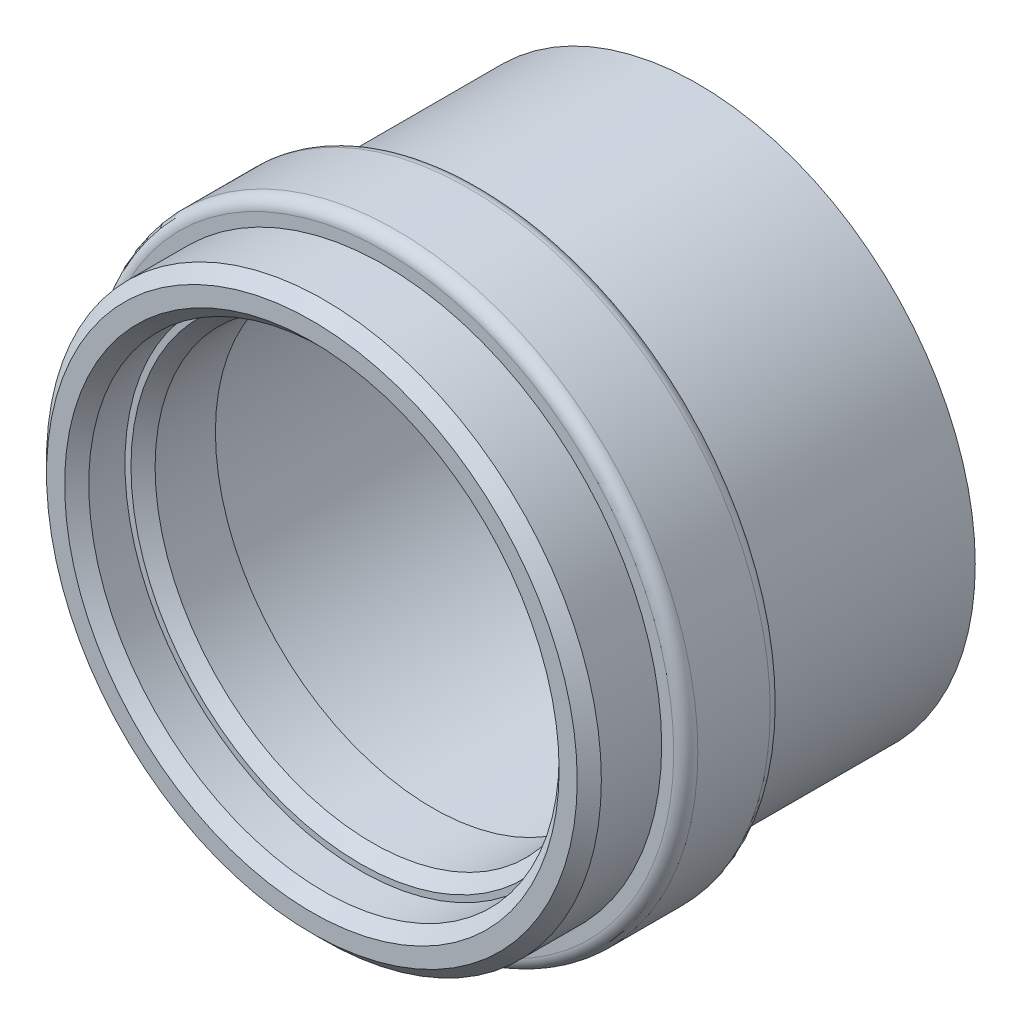
ISO-10303-21;
HEADER;
FILE_DESCRIPTION(('STEP AP214'),'2;1');
FILE_NAME('part.step','',(''),(''),'','','');
FILE_SCHEMA(('AUTOMOTIVE_DESIGN { 1 0 10303 214 1 1 1 1 }'));
ENDSEC;
DATA;
#1=APPLICATION_CONTEXT('core data for automotive mechanical design processes');
#2=APPLICATION_PROTOCOL_DEFINITION('international standard','automotive_design',2000,#1);
#3=PRODUCT_CONTEXT('',#1,'mechanical');
#4=PRODUCT('Part','Part','',(#3));
#5=PRODUCT_RELATED_PRODUCT_CATEGORY('part','',(#4));
#6=PRODUCT_DEFINITION_FORMATION('','',#4);
#7=PRODUCT_DEFINITION_CONTEXT('part definition',#1,'design');
#8=PRODUCT_DEFINITION('design','',#6,#7);
#9=PRODUCT_DEFINITION_SHAPE('','',#8);
#10=(LENGTH_UNIT() NAMED_UNIT(*) SI_UNIT(.MILLI.,.METRE.));
#11=(NAMED_UNIT(*) PLANE_ANGLE_UNIT() SI_UNIT($,.RADIAN.));
#12=(NAMED_UNIT(*) SI_UNIT($,.STERADIAN.) SOLID_ANGLE_UNIT());
#13=UNCERTAINTY_MEASURE_WITH_UNIT(LENGTH_MEASURE(1.E-05),#10,'distance_accuracy_value','');
#14=(GEOMETRIC_REPRESENTATION_CONTEXT(3) GLOBAL_UNCERTAINTY_ASSIGNED_CONTEXT((#13)) GLOBAL_UNIT_ASSIGNED_CONTEXT((#10,
#11,#12)) REPRESENTATION_CONTEXT('',''));
#15=CARTESIAN_POINT('',(0.,0.,0.));
#16=DIRECTION('',(0.,0.,1.));
#17=DIRECTION('',(1.,0.,0.));
#18=AXIS2_PLACEMENT_3D('',#15,#16,#17);
#19=CARTESIAN_POINT('',(0.,0.,0.));
#20=DIRECTION('',(0.,0.,1.));
#21=DIRECTION('',(1.,0.,0.));
#22=AXIS2_PLACEMENT_3D('',#19,#20,#21);
#23=CYLINDRICAL_SURFACE('',#22,9.);
#24=CARTESIAN_POINT('',(0.,0.,13.5));
#25=DIRECTION('',(0.,0.,1.));
#26=DIRECTION('',(1.,0.,0.));
#27=AXIS2_PLACEMENT_3D('',#24,#25,#26);
#28=CIRCLE('',#27,9.);
#29=CARTESIAN_POINT('',(9.,0.,13.5));
#30=VERTEX_POINT('',#29);
#31=EDGE_CURVE('E77',#30,#30,#28,.T.);
#32=ORIENTED_EDGE('',*,*,#31,.T.);
#33=EDGE_LOOP('',(#32));
#34=FACE_BOUND('',#33,.T.);
#35=CARTESIAN_POINT('',(0.,0.,11.));
#36=DIRECTION('',(0.,0.,-1.));
#37=DIRECTION('',(-1.,0.,0.));
#38=AXIS2_PLACEMENT_3D('',#35,#36,#37);
#39=CIRCLE('',#38,9.);
#40=CARTESIAN_POINT('',(-9.,0.,11.));
#41=VERTEX_POINT('',#40);
#42=EDGE_CURVE('E102',#41,#41,#39,.F.);
#43=ORIENTED_EDGE('',*,*,#42,.F.);
#44=EDGE_LOOP('',(#43));
#45=FACE_BOUND('',#44,.T.);
#46=ADVANCED_FACE('F45',(#34,#45),#23,.F.);
#47=CARTESIAN_POINT('',(0.,0.,16.));
#48=DIRECTION('',(0.,0.,-1.));
#49=DIRECTION('',(-1.,0.,0.));
#50=AXIS2_PLACEMENT_3D('',#47,#48,#49);
#51=CYLINDRICAL_SURFACE('',#50,11.5);
#52=CARTESIAN_POINT('',(0.,0.,0.));
#53=DIRECTION('',(0.,0.,1.));
#54=DIRECTION('',(1.,0.,0.));
#55=AXIS2_PLACEMENT_3D('',#52,#53,#54);
#56=CIRCLE('',#55,11.5);
#57=CARTESIAN_POINT('',(11.5,0.,0.));
#58=VERTEX_POINT('',#57);
#59=EDGE_CURVE('E111',#58,#58,#56,.T.);
#60=ORIENTED_EDGE('',*,*,#59,.T.);
#61=EDGE_LOOP('',(#60));
#62=FACE_BOUND('',#61,.T.);
#63=CARTESIAN_POINT('',(0.,0.,9.));
#64=DIRECTION('',(0.,0.,1.));
#65=DIRECTION('',(1.,0.,0.));
#66=AXIS2_PLACEMENT_3D('',#63,#64,#65);
#67=CIRCLE('',#66,11.5);
#68=CARTESIAN_POINT('',(11.5,0.,9.));
#69=VERTEX_POINT('',#68);
#70=EDGE_CURVE('E101',#69,#69,#67,.T.);
#71=ORIENTED_EDGE('',*,*,#70,.F.);
#72=EDGE_LOOP('',(#71));
#73=FACE_BOUND('',#72,.T.);
#74=ADVANCED_FACE('F146',(#62,#73),#51,.T.);
#75=CARTESIAN_POINT('',(0.,0.,0.));
#76=DIRECTION('',(0.,0.,1.));
#77=DIRECTION('',(1.,0.,0.));
#78=AXIS2_PLACEMENT_3D('',#75,#76,#77);
#79=PLANE('',#78);
#80=CARTESIAN_POINT('',(0.,0.,0.));
#81=DIRECTION('',(0.,0.,1.));
#82=DIRECTION('',(1.,0.,0.));
#83=AXIS2_PLACEMENT_3D('',#80,#81,#82);
#84=CIRCLE('',#83,10.5);
#85=CARTESIAN_POINT('',(10.5,0.,0.));
#86=VERTEX_POINT('',#85);
#87=EDGE_CURVE('E93',#86,#86,#84,.T.);
#88=ORIENTED_EDGE('',*,*,#87,.T.);
#89=EDGE_LOOP('',(#88));
#90=FACE_BOUND('',#89,.T.);
#91=ORIENTED_EDGE('',*,*,#59,.F.);
#92=EDGE_LOOP('',(#91));
#93=FACE_BOUND('',#92,.T.);
#94=ADVANCED_FACE('F152',(#90,#93),#79,.F.);
#95=CARTESIAN_POINT('',(0.,0.,9.));
#96=DIRECTION('',(0.,0.,1.));
#97=DIRECTION('',(1.,0.,0.));
#98=AXIS2_PLACEMENT_3D('',#95,#96,#97);
#99=CYLINDRICAL_SURFACE('',#98,12.5);
#100=CARTESIAN_POINT('',(0.,0.,9.5));
#101=DIRECTION('',(0.,0.,1.));
#102=DIRECTION('',(1.,0.,0.));
#103=AXIS2_PLACEMENT_3D('',#100,#101,#102);
#104=CIRCLE('',#103,12.5);
#105=CARTESIAN_POINT('',(12.5,0.,9.5));
#106=VERTEX_POINT('',#105);
#107=EDGE_CURVE('E58',#106,#106,#104,.T.);
#108=ORIENTED_EDGE('',*,*,#107,.T.);
#109=EDGE_LOOP('',(#108));
#110=FACE_BOUND('',#109,.T.);
#111=CARTESIAN_POINT('',(0.,0.,12.5));
#112=DIRECTION('',(0.,0.,1.));
#113=DIRECTION('',(1.,0.,0.));
#114=AXIS2_PLACEMENT_3D('',#111,#112,#113);
#115=CIRCLE('',#114,12.5);
#116=CARTESIAN_POINT('',(12.5,0.,12.5));
#117=VERTEX_POINT('',#116);
#118=EDGE_CURVE('E63',#117,#117,#115,.F.);
#119=ORIENTED_EDGE('',*,*,#118,.T.);
#120=EDGE_LOOP('',(#119));
#121=FACE_BOUND('',#120,.T.);
#122=ADVANCED_FACE('F168',(#110,#121),#99,.T.);
#123=CARTESIAN_POINT('',(0.,0.,9.));
#124=DIRECTION('',(0.,0.,1.));
#125=DIRECTION('',(1.,0.,0.));
#126=AXIS2_PLACEMENT_3D('',#123,#124,#125);
#127=PLANE('',#126);
#128=CARTESIAN_POINT('',(0.,0.,9.));
#129=DIRECTION('',(0.,0.,1.));
#130=DIRECTION('',(1.,0.,0.));
#131=AXIS2_PLACEMENT_3D('',#128,#129,#130);
#132=CIRCLE('',#131,12.);
#133=CARTESIAN_POINT('',(12.,0.,9.));
#134=VERTEX_POINT('',#133);
#135=EDGE_CURVE('E53',#134,#134,#132,.F.);
#136=ORIENTED_EDGE('',*,*,#135,.T.);
#137=EDGE_LOOP('',(#136));
#138=FACE_BOUND('',#137,.T.);
#139=ORIENTED_EDGE('',*,*,#70,.T.);
#140=EDGE_LOOP('',(#139));
#141=FACE_BOUND('',#140,.T.);
#142=ADVANCED_FACE('F164',(#138,#141),#127,.F.);
#143=CARTESIAN_POINT('',(0.,0.,13.));
#144=DIRECTION('',(0.,0.,1.));
#145=DIRECTION('',(1.,0.,0.));
#146=AXIS2_PLACEMENT_3D('',#143,#144,#145);
#147=PLANE('',#146);
#148=CARTESIAN_POINT('',(0.,0.,13.));
#149=DIRECTION('',(0.,0.,1.));
#150=DIRECTION('',(1.,0.,0.));
#151=AXIS2_PLACEMENT_3D('',#148,#149,#150);
#152=CIRCLE('',#151,12.);
#153=CARTESIAN_POINT('',(12.,0.,13.));
#154=VERTEX_POINT('',#153);
#155=EDGE_CURVE('E10',#154,#154,#152,.T.);
#156=ORIENTED_EDGE('',*,*,#155,.T.);
#157=EDGE_LOOP('',(#156));
#158=FACE_BOUND('',#157,.T.);
#159=CARTESIAN_POINT('',(0.,0.,13.));
#160=DIRECTION('',(0.,0.,1.));
#161=DIRECTION('',(1.,0.,0.));
#162=AXIS2_PLACEMENT_3D('',#159,#160,#161);
#163=CIRCLE('',#162,11.5);
#164=CARTESIAN_POINT('',(11.5,0.,13.));
#165=VERTEX_POINT('',#164);
#166=EDGE_CURVE('E112',#165,#165,#163,.T.);
#167=ORIENTED_EDGE('',*,*,#166,.F.);
#168=EDGE_LOOP('',(#167));
#169=FACE_BOUND('',#168,.T.);
#170=ADVANCED_FACE('F167',(#158,#169),#147,.T.);
#171=CARTESIAN_POINT('',(0.,0.,16.));
#172=DIRECTION('',(0.,0.,1.));
#173=DIRECTION('',(1.,0.,0.));
#174=AXIS2_PLACEMENT_3D('',#171,#172,#173);
#175=PLANE('',#174);
#176=CARTESIAN_POINT('',(0.,0.,16.));
#177=DIRECTION('',(0.,0.,1.));
#178=DIRECTION('',(1.,0.,0.));
#179=AXIS2_PLACEMENT_3D('',#176,#177,#178);
#180=CIRCLE('',#179,11.);
#181=CARTESIAN_POINT('',(11.,0.,16.));
#182=VERTEX_POINT('',#181);
#183=EDGE_CURVE('E85',#182,#182,#180,.T.);
#184=ORIENTED_EDGE('',*,*,#183,.T.);
#185=EDGE_LOOP('',(#184));
#186=FACE_BOUND('',#185,.T.);
#187=CARTESIAN_POINT('',(0.,0.,16.));
#188=DIRECTION('',(0.,0.,1.));
#189=DIRECTION('',(1.,0.,0.));
#190=AXIS2_PLACEMENT_3D('',#187,#188,#189);
#191=CIRCLE('',#190,10.25);
#192=CARTESIAN_POINT('',(10.25,0.,16.));
#193=VERTEX_POINT('',#192);
#194=EDGE_CURVE('E89',#193,#193,#191,.F.);
#195=ORIENTED_EDGE('',*,*,#194,.T.);
#196=EDGE_LOOP('',(#195));
#197=FACE_BOUND('',#196,.T.);
#198=ADVANCED_FACE('F171',(#186,#197),#175,.T.);
#199=CARTESIAN_POINT('',(0.,0.,15.5));
#200=DIRECTION('',(0.,0.,1.));
#201=DIRECTION('',(1.,0.,0.));
#202=AXIS2_PLACEMENT_3D('',#199,#200,#201);
#203=CIRCLE('',#202,11.5);
#204=CARTESIAN_POINT('',(11.5,0.,15.5));
#205=VERTEX_POINT('',#204);
#206=EDGE_CURVE('E81',#205,#205,#203,.F.);
#207=ORIENTED_EDGE('',*,*,#206,.T.);
#208=EDGE_LOOP('',(#207));
#209=FACE_BOUND('',#208,.T.);
#210=ORIENTED_EDGE('',*,*,#166,.T.);
#211=EDGE_LOOP('',(#210));
#212=FACE_BOUND('',#211,.T.);
#213=ADVANCED_FACE('F155',(#209,#212),#51,.T.);
#214=CARTESIAN_POINT('',(0.,0.,14.));
#215=DIRECTION('',(0.,0.,1.));
#216=DIRECTION('',(1.,0.,0.));
#217=AXIS2_PLACEMENT_3D('',#214,#215,#216);
#218=CYLINDRICAL_SURFACE('',#217,9.75);
#219=CARTESIAN_POINT('',(0.,0.,15.5));
#220=DIRECTION('',(0.,0.,1.));
#221=DIRECTION('',(1.,0.,0.));
#222=AXIS2_PLACEMENT_3D('',#219,#220,#221);
#223=CIRCLE('',#222,9.75);
#224=CARTESIAN_POINT('',(9.75,0.,15.5));
#225=VERTEX_POINT('',#224);
#226=EDGE_CURVE('E69',#225,#225,#223,.T.);
#227=ORIENTED_EDGE('',*,*,#226,.T.);
#228=EDGE_LOOP('',(#227));
#229=FACE_BOUND('',#228,.T.);
#230=CARTESIAN_POINT('',(0.,0.,14.));
#231=DIRECTION('',(0.,0.,1.));
#232=DIRECTION('',(1.,0.,0.));
#233=AXIS2_PLACEMENT_3D('',#230,#231,#232);
#234=CIRCLE('',#233,9.75);
#235=CARTESIAN_POINT('',(9.75,0.,14.));
#236=VERTEX_POINT('',#235);
#237=EDGE_CURVE('E106',#236,#236,#234,.T.);
#238=ORIENTED_EDGE('',*,*,#237,.F.);
#239=EDGE_LOOP('',(#238));
#240=FACE_BOUND('',#239,.T.);
#241=ADVANCED_FACE('F159',(#229,#240),#218,.F.);
#242=CARTESIAN_POINT('',(0.,0.,14.));
#243=DIRECTION('',(0.,0.,1.));
#244=DIRECTION('',(1.,0.,0.));
#245=AXIS2_PLACEMENT_3D('',#242,#243,#244);
#246=PLANE('',#245);
#247=CARTESIAN_POINT('',(0.,0.,14.));
#248=DIRECTION('',(0.,0.,1.));
#249=DIRECTION('',(1.,0.,0.));
#250=AXIS2_PLACEMENT_3D('',#247,#248,#249);
#251=CIRCLE('',#250,9.49999999999999);
#252=CARTESIAN_POINT('',(9.49999999999999,0.,14.));
#253=VERTEX_POINT('',#252);
#254=EDGE_CURVE('E73',#253,#253,#251,.F.);
#255=ORIENTED_EDGE('',*,*,#254,.T.);
#256=EDGE_LOOP('',(#255));
#257=FACE_BOUND('',#256,.T.);
#258=ORIENTED_EDGE('',*,*,#237,.T.);
#259=EDGE_LOOP('',(#258));
#260=FACE_BOUND('',#259,.T.);
#261=ADVANCED_FACE('F142',(#257,#260),#246,.T.);
#262=CARTESIAN_POINT('',(0.,0.,11.));
#263=DIRECTION('',(0.,0.,-1.));
#264=DIRECTION('',(-1.,0.,0.));
#265=AXIS2_PLACEMENT_3D('',#262,#263,#264);
#266=PLANE('',#265);
#267=CARTESIAN_POINT('',(0.,0.,11.));
#268=DIRECTION('',(0.,0.,-1.));
#269=DIRECTION('',(-1.,0.,0.));
#270=AXIS2_PLACEMENT_3D('',#267,#268,#269);
#271=CIRCLE('',#270,10.);
#272=CARTESIAN_POINT('',(-10.,0.,11.));
#273=VERTEX_POINT('',#272);
#274=EDGE_CURVE('E107',#273,#273,#271,.T.);
#275=ORIENTED_EDGE('',*,*,#274,.T.);
#276=EDGE_LOOP('',(#275));
#277=FACE_BOUND('',#276,.T.);
#278=ORIENTED_EDGE('',*,*,#42,.T.);
#279=EDGE_LOOP('',(#278));
#280=FACE_BOUND('',#279,.T.);
#281=ADVANCED_FACE('F126',(#277,#280),#266,.T.);
#282=CARTESIAN_POINT('',(0.,0.,11.));
#283=DIRECTION('',(0.,0.,-1.));
#284=DIRECTION('',(-1.,0.,0.));
#285=AXIS2_PLACEMENT_3D('',#282,#283,#284);
#286=CYLINDRICAL_SURFACE('',#285,10.);
#287=CARTESIAN_POINT('',(0.,0.,0.500000000000002));
#288=DIRECTION('',(0.,0.,1.));
#289=DIRECTION('',(1.,0.,0.));
#290=AXIS2_PLACEMENT_3D('',#287,#288,#289);
#291=CIRCLE('',#290,10.);
#292=CARTESIAN_POINT('',(10.,0.,0.500000000000002));
#293=VERTEX_POINT('',#292);
#294=EDGE_CURVE('E97',#293,#293,#291,.F.);
#295=ORIENTED_EDGE('',*,*,#294,.T.);
#296=EDGE_LOOP('',(#295));
#297=FACE_BOUND('',#296,.T.);
#298=ORIENTED_EDGE('',*,*,#274,.F.);
#299=EDGE_LOOP('',(#298));
#300=FACE_BOUND('',#299,.T.);
#301=ADVANCED_FACE('F129',(#297,#300),#286,.F.);
#302=CARTESIAN_POINT('',(0.,0.,0.500000000000002));
#303=DIRECTION('',(0.,0.,-1.));
#304=DIRECTION('',(-1.,0.,0.));
#305=AXIS2_PLACEMENT_3D('',#302,#303,#304);
#306=CONICAL_SURFACE('',#305,10.,0.785398163397452);
#307=ORIENTED_EDGE('',*,*,#87,.F.);
#308=EDGE_LOOP('',(#307));
#309=FACE_BOUND('',#308,.T.);
#310=ORIENTED_EDGE('',*,*,#294,.F.);
#311=EDGE_LOOP('',(#310));
#312=FACE_BOUND('',#311,.T.);
#313=ADVANCED_FACE('F131',(#309,#312),#306,.F.);
#314=CARTESIAN_POINT('',(0.,0.,16.));
#315=DIRECTION('',(0.,0.,-1.));
#316=DIRECTION('',(-1.,0.,0.));
#317=AXIS2_PLACEMENT_3D('',#314,#315,#316);
#318=CONICAL_SURFACE('',#317,11.,0.785398163397445);
#319=ORIENTED_EDGE('',*,*,#206,.F.);
#320=EDGE_LOOP('',(#319));
#321=FACE_BOUND('',#320,.T.);
#322=ORIENTED_EDGE('',*,*,#183,.F.);
#323=EDGE_LOOP('',(#322));
#324=FACE_BOUND('',#323,.T.);
#325=ADVANCED_FACE('F138',(#321,#324),#318,.T.);
#326=CARTESIAN_POINT('',(0.,0.,13.5));
#327=DIRECTION('',(0.,0.,1.));
#328=DIRECTION('',(1.,0.,0.));
#329=AXIS2_PLACEMENT_3D('',#326,#327,#328);
#330=CONICAL_SURFACE('',#329,9.,0.785398163397448);
#331=ORIENTED_EDGE('',*,*,#254,.F.);
#332=EDGE_LOOP('',(#331));
#333=FACE_BOUND('',#332,.T.);
#334=ORIENTED_EDGE('',*,*,#31,.F.);
#335=EDGE_LOOP('',(#334));
#336=FACE_BOUND('',#335,.T.);
#337=ADVANCED_FACE('F191',(#333,#336),#330,.F.);
#338=CARTESIAN_POINT('',(0.,0.,15.5));
#339=DIRECTION('',(0.,0.,1.));
#340=DIRECTION('',(1.,0.,0.));
#341=AXIS2_PLACEMENT_3D('',#338,#339,#340);
#342=CONICAL_SURFACE('',#341,9.75,0.78539816339745);
#343=ORIENTED_EDGE('',*,*,#194,.F.);
#344=EDGE_LOOP('',(#343));
#345=FACE_BOUND('',#344,.T.);
#346=ORIENTED_EDGE('',*,*,#226,.F.);
#347=EDGE_LOOP('',(#346));
#348=FACE_BOUND('',#347,.T.);
#349=ADVANCED_FACE('F198',(#345,#348),#342,.F.);
#350=CARTESIAN_POINT('',(0.,0.,9.5));
#351=DIRECTION('',(0.,0.,1.));
#352=DIRECTION('',(1.,0.,0.));
#353=AXIS2_PLACEMENT_3D('',#350,#351,#352);
#354=TOROIDAL_SURFACE('',#353,12.,0.5);
#355=ORIENTED_EDGE('',*,*,#135,.F.);
#356=EDGE_LOOP('',(#355));
#357=FACE_BOUND('',#356,.T.);
#358=ORIENTED_EDGE('',*,*,#107,.F.);
#359=EDGE_LOOP('',(#358));
#360=FACE_BOUND('',#359,.T.);
#361=ADVANCED_FACE('F203',(#357,#360),#354,.T.);
#362=CARTESIAN_POINT('',(0.,0.,12.5));
#363=DIRECTION('',(0.,0.,1.));
#364=DIRECTION('',(1.,0.,0.));
#365=AXIS2_PLACEMENT_3D('',#362,#363,#364);
#366=TOROIDAL_SURFACE('',#365,12.,0.5);
#367=ORIENTED_EDGE('',*,*,#118,.F.);
#368=EDGE_LOOP('',(#367));
#369=FACE_BOUND('',#368,.T.);
#370=ORIENTED_EDGE('',*,*,#155,.F.);
#371=EDGE_LOOP('',(#370));
#372=FACE_BOUND('',#371,.T.);
#373=ADVANCED_FACE('F47',(#369,#372),#366,.T.);
#374=CLOSED_SHELL('',(#46,#74,#94,#122,#142,#170,#198,#213,#241,#261,#281,#301,#313,#325,#337,
#349,#361,#373));
#375=MANIFOLD_SOLID_BREP('B2',#374);
#376=ADVANCED_BREP_SHAPE_REPRESENTATION('',(#18,#375),#14);
#377=SHAPE_DEFINITION_REPRESENTATION(#9,#376);
ENDSEC;
END-ISO-10303-21;
